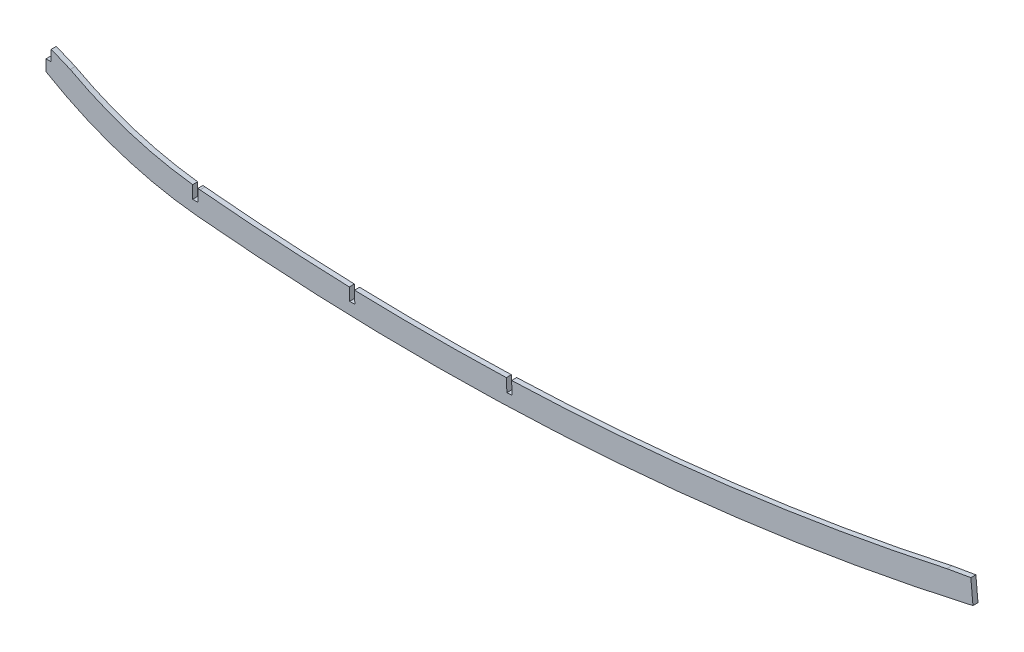
ISO-10303-21;
HEADER;
FILE_DESCRIPTION(('STEP AP214'),'2;1');
FILE_NAME('part.step','',(''),(''),'','','');
FILE_SCHEMA(('AUTOMOTIVE_DESIGN { 1 0 10303 214 1 1 1 1 }'));
ENDSEC;
DATA;
#1=APPLICATION_CONTEXT('core data for automotive mechanical design processes');
#2=APPLICATION_PROTOCOL_DEFINITION('international standard','automotive_design',2000,#1);
#3=PRODUCT_CONTEXT('',#1,'mechanical');
#4=PRODUCT('Part','Part','',(#3));
#5=PRODUCT_RELATED_PRODUCT_CATEGORY('part','',(#4));
#6=PRODUCT_DEFINITION_FORMATION('','',#4);
#7=PRODUCT_DEFINITION_CONTEXT('part definition',#1,'design');
#8=PRODUCT_DEFINITION('design','',#6,#7);
#9=PRODUCT_DEFINITION_SHAPE('','',#8);
#10=(LENGTH_UNIT() NAMED_UNIT(*) SI_UNIT(.MILLI.,.METRE.));
#11=(NAMED_UNIT(*) PLANE_ANGLE_UNIT() SI_UNIT($,.RADIAN.));
#12=(NAMED_UNIT(*) SI_UNIT($,.STERADIAN.) SOLID_ANGLE_UNIT());
#13=UNCERTAINTY_MEASURE_WITH_UNIT(LENGTH_MEASURE(1.E-05),#10,'distance_accuracy_value','');
#14=(GEOMETRIC_REPRESENTATION_CONTEXT(3) GLOBAL_UNCERTAINTY_ASSIGNED_CONTEXT((#13)) GLOBAL_UNIT_ASSIGNED_CONTEXT((#10,
#11,#12)) REPRESENTATION_CONTEXT('',''));
#15=CARTESIAN_POINT('',(0.,0.,0.));
#16=DIRECTION('',(0.,0.,1.));
#17=DIRECTION('',(1.,0.,0.));
#18=AXIS2_PLACEMENT_3D('',#15,#16,#17);
#19=CARTESIAN_POINT('',(240.577079738142,1407.58831419098,1.5875));
#20=DIRECTION('',(0.,0.,-1.));
#21=DIRECTION('',(-1.,0.,0.));
#22=AXIS2_PLACEMENT_3D('',#19,#20,#21);
#23=CYLINDRICAL_SURFACE('',#22,1527.94116944839);
#24=CARTESIAN_POINT('',(240.577079738142,1407.58831419098,-1.5875));
#25=DIRECTION('',(0.,0.,1.));
#26=DIRECTION('',(1.,0.,0.));
#27=AXIS2_PLACEMENT_3D('',#24,#25,#26);
#28=CIRCLE('',#27,1527.94116944839);
#29=CARTESIAN_POINT('',(293.085752085941,-119.450341712521,-1.5875));
#30=VERTEX_POINT('',#29);
#31=CARTESIAN_POINT('',(567.129437002182,-85.0495438511498,-1.5875));
#32=VERTEX_POINT('',#31);
#33=EDGE_CURVE('E217',#30,#32,#28,.T.);
#34=ORIENTED_EDGE('',*,*,#33,.F.);
#35=DIRECTION('',(0.,0.,-1.));
#36=VECTOR('',#35,1.);
#37=CARTESIAN_POINT('',(293.085752085941,-119.450341712521,1.5875));
#38=LINE('',#37,#36);
#39=CARTESIAN_POINT('',(293.085752085941,-119.450341712521,1.5875));
#40=VERTEX_POINT('',#39);
#41=EDGE_CURVE('E11',#40,#30,#38,.T.);
#42=ORIENTED_EDGE('',*,*,#41,.F.);
#43=CARTESIAN_POINT('',(240.577079738142,1407.58831419098,1.5875));
#44=DIRECTION('',(0.,0.,1.));
#45=DIRECTION('',(1.,0.,0.));
#46=AXIS2_PLACEMENT_3D('',#43,#44,#45);
#47=CIRCLE('',#46,1527.94116944839);
#48=CARTESIAN_POINT('',(567.129437002182,-85.0495438511498,1.5875));
#49=VERTEX_POINT('',#48);
#50=EDGE_CURVE('E278',#40,#49,#47,.T.);
#51=ORIENTED_EDGE('',*,*,#50,.T.);
#52=DIRECTION('',(0.,0.,-1.));
#53=VECTOR('',#52,1.);
#54=CARTESIAN_POINT('',(567.129437002182,-85.0495438511498,1.5875));
#55=LINE('',#54,#53);
#56=EDGE_CURVE('E55',#49,#32,#55,.T.);
#57=ORIENTED_EDGE('',*,*,#56,.T.);
#58=EDGE_LOOP('',(#34,#42,#51,#57));
#59=FACE_BOUND('',#58,.T.);
#60=ADVANCED_FACE('F39',(#59),#23,.F.);
#61=CARTESIAN_POINT('',(287.4127535148,12.3691297078382,1.5875));
#62=DIRECTION('',(-0.999075230575242,-0.0429963213662236,0.));
#63=DIRECTION('',(0.0429963213662236,-0.999075230575242,0.));
#64=AXIS2_PLACEMENT_3D('',#61,#62,#63);
#65=PLANE('',#64);
#66=DIRECTION('',(-0.0429963213662236,0.999075230575242,0.));
#67=VECTOR('',#66,1.);
#68=CARTESIAN_POINT('',(287.4127535148,12.3691297078382,-1.5875));
#69=LINE('',#68,#67);
#70=CARTESIAN_POINT('',(293.430570154345,-127.462636258907,-1.5875));
#71=VERTEX_POINT('',#70);
#72=EDGE_CURVE('E219',#71,#30,#69,.T.);
#73=ORIENTED_EDGE('',*,*,#72,.F.);
#74=DIRECTION('',(0.,0.,-1.));
#75=VECTOR('',#74,1.);
#76=CARTESIAN_POINT('',(293.430570154345,-127.462636258907,1.5875));
#77=LINE('',#76,#75);
#78=CARTESIAN_POINT('',(293.430570154345,-127.462636258907,1.5875));
#79=VERTEX_POINT('',#78);
#80=EDGE_CURVE('E47',#79,#71,#77,.T.);
#81=ORIENTED_EDGE('',*,*,#80,.F.);
#82=DIRECTION('',(-0.0429963213662236,0.999075230575242,0.));
#83=VECTOR('',#82,1.);
#84=CARTESIAN_POINT('',(287.4127535148,12.3691297078382,1.5875));
#85=LINE('',#84,#83);
#86=EDGE_CURVE('E338',#79,#40,#85,.T.);
#87=ORIENTED_EDGE('',*,*,#86,.T.);
#88=ORIENTED_EDGE('',*,*,#41,.T.);
#89=EDGE_LOOP('',(#73,#81,#87,#88));
#90=FACE_BOUND('',#89,.T.);
#91=ADVANCED_FACE('F323',(#90),#65,.T.);
#92=CARTESIAN_POINT('',(6.01781663954573,-139.831765966747,1.5875));
#93=DIRECTION('',(-0.0429963213662297,0.999075230575242,0.));
#94=DIRECTION('',(-0.999075230575242,-0.0429963213662297,0.));
#95=AXIS2_PLACEMENT_3D('',#92,#93,#94);
#96=PLANE('',#95);
#97=DIRECTION('',(0.999075230575242,0.0429963213662298,0.));
#98=VECTOR('',#97,1.);
#99=CARTESIAN_POINT('',(6.01781663954573,-139.831765966747,-1.5875));
#100=LINE('',#99,#98);
#101=CARTESIAN_POINT('',(290.131623742986,-127.604610112058,-1.5875));
#102=VERTEX_POINT('',#101);
#103=EDGE_CURVE('E222',#102,#71,#100,.T.);
#104=ORIENTED_EDGE('',*,*,#103,.F.);
#105=DIRECTION('',(0.,0.,-1.));
#106=VECTOR('',#105,1.);
#107=CARTESIAN_POINT('',(290.131623742986,-127.604610112058,1.5875));
#108=LINE('',#107,#106);
#109=CARTESIAN_POINT('',(290.131623742986,-127.604610112058,1.5875));
#110=VERTEX_POINT('',#109);
#111=EDGE_CURVE('E312',#110,#102,#108,.T.);
#112=ORIENTED_EDGE('',*,*,#111,.F.);
#113=DIRECTION('',(0.999075230575242,0.0429963213662298,0.));
#114=VECTOR('',#113,1.);
#115=CARTESIAN_POINT('',(6.01781663954573,-139.831765966747,1.5875));
#116=LINE('',#115,#114);
#117=EDGE_CURVE('E319',#110,#79,#116,.T.);
#118=ORIENTED_EDGE('',*,*,#117,.T.);
#119=ORIENTED_EDGE('',*,*,#80,.T.);
#120=EDGE_LOOP('',(#104,#112,#118,#119));
#121=FACE_BOUND('',#120,.T.);
#122=ADVANCED_FACE('F317',(#121),#96,.T.);
#123=CARTESIAN_POINT('',(284.11380710344,12.2271558546878,1.5875));
#124=DIRECTION('',(-0.999075230575242,-0.0429963213662266,0.));
#125=DIRECTION('',(0.0429963213662266,-0.999075230575242,0.));
#126=AXIS2_PLACEMENT_3D('',#123,#124,#125);
#127=PLANE('',#126);
#128=DIRECTION('',(-0.0429963213662266,0.999075230575242,0.));
#129=VECTOR('',#128,1.);
#130=CARTESIAN_POINT('',(284.11380710344,12.2271558546878,-1.5875));
#131=LINE('',#130,#129);
#132=CARTESIAN_POINT('',(289.785425962609,-119.560256170512,-1.5875));
#133=VERTEX_POINT('',#132);
#134=EDGE_CURVE('E225',#102,#133,#131,.T.);
#135=ORIENTED_EDGE('',*,*,#134,.T.);
#136=DIRECTION('',(0.,0.,-1.));
#137=VECTOR('',#136,1.);
#138=CARTESIAN_POINT('',(289.785425962609,-119.560256170512,1.5875));
#139=LINE('',#138,#137);
#140=CARTESIAN_POINT('',(289.785425962609,-119.560256170512,1.5875));
#141=VERTEX_POINT('',#140);
#142=EDGE_CURVE('E310',#141,#133,#139,.T.);
#143=ORIENTED_EDGE('',*,*,#142,.F.);
#144=DIRECTION('',(-0.0429963213662266,0.999075230575242,0.));
#145=VECTOR('',#144,1.);
#146=CARTESIAN_POINT('',(284.11380710344,12.2271558546878,1.5875));
#147=LINE('',#146,#145);
#148=EDGE_CURVE('E334',#110,#141,#147,.T.);
#149=ORIENTED_EDGE('',*,*,#148,.F.);
#150=ORIENTED_EDGE('',*,*,#111,.T.);
#151=EDGE_LOOP('',(#135,#143,#149,#150));
#152=FACE_BOUND('',#151,.T.);
#153=ADVANCED_FACE('F331',(#152),#127,.F.);
#154=CARTESIAN_POINT('',(240.577079738142,1407.58831419098,1.5875));
#155=DIRECTION('',(0.,0.,-1.));
#156=DIRECTION('',(-1.,0.,0.));
#157=AXIS2_PLACEMENT_3D('',#154,#155,#156);
#158=CYLINDRICAL_SURFACE('',#157,1527.94116944839);
#159=CARTESIAN_POINT('',(240.577079738142,1407.58831419098,-1.5875));
#160=DIRECTION('',(0.,0.,1.));
#161=DIRECTION('',(1.,0.,0.));
#162=AXIS2_PLACEMENT_3D('',#159,#160,#161);
#163=CIRCLE('',#162,1527.94116944839);
#164=CARTESIAN_POINT('',(194.229812032864,-119.649764194821,-1.5875));
#165=VERTEX_POINT('',#164);
#166=EDGE_CURVE('E228',#165,#133,#163,.T.);
#167=ORIENTED_EDGE('',*,*,#166,.F.);
#168=DIRECTION('',(0.,0.,-1.));
#169=VECTOR('',#168,1.);
#170=CARTESIAN_POINT('',(194.229812032864,-119.649764194821,1.5875));
#171=LINE('',#170,#169);
#172=CARTESIAN_POINT('',(194.229812032864,-119.649764194821,1.5875));
#173=VERTEX_POINT('',#172);
#174=EDGE_CURVE('E308',#173,#165,#171,.T.);
#175=ORIENTED_EDGE('',*,*,#174,.F.);
#176=CARTESIAN_POINT('',(240.577079738142,1407.58831419098,1.5875));
#177=DIRECTION('',(0.,0.,1.));
#178=DIRECTION('',(1.,0.,0.));
#179=AXIS2_PLACEMENT_3D('',#176,#177,#178);
#180=CIRCLE('',#179,1527.94116944839);
#181=EDGE_CURVE('E336',#173,#141,#180,.T.);
#182=ORIENTED_EDGE('',*,*,#181,.T.);
#183=ORIENTED_EDGE('',*,*,#142,.T.);
#184=EDGE_LOOP('',(#167,#175,#182,#183));
#185=FACE_BOUND('',#184,.T.);
#186=ADVANCED_FACE('F583',(#185),#158,.F.);
#187=CARTESIAN_POINT('',(191.641201645556,4.01163506310581,1.5875));
#188=DIRECTION('',(0.999780975664747,0.0209284662325422,0.));
#189=DIRECTION('',(-0.0209284662325422,0.999780975664747,0.));
#190=AXIS2_PLACEMENT_3D('',#187,#188,#189);
#191=PLANE('',#190);
#192=DIRECTION('',(0.0209284662325422,-0.999780975664747,0.));
#193=VECTOR('',#192,1.);
#194=CARTESIAN_POINT('',(191.641201645556,4.01163506310581,-1.5875));
#195=LINE('',#194,#193);
#196=CARTESIAN_POINT('',(194.389286945556,-127.268095229386,-1.5875));
#197=VERTEX_POINT('',#196);
#198=EDGE_CURVE('E231',#165,#197,#195,.T.);
#199=ORIENTED_EDGE('',*,*,#198,.T.);
#200=DIRECTION('',(0.,0.,-1.));
#201=VECTOR('',#200,1.);
#202=CARTESIAN_POINT('',(194.389286945556,-127.268095229386,1.5875));
#203=LINE('',#202,#201);
#204=CARTESIAN_POINT('',(194.389286945556,-127.268095229386,1.5875));
#205=VERTEX_POINT('',#204);
#206=EDGE_CURVE('E306',#205,#197,#203,.T.);
#207=ORIENTED_EDGE('',*,*,#206,.F.);
#208=DIRECTION('',(0.0209284662325422,-0.999780975664747,0.));
#209=VECTOR('',#208,1.);
#210=CARTESIAN_POINT('',(191.641201645556,4.01163506310581,1.5875));
#211=LINE('',#210,#209);
#212=EDGE_CURVE('E344',#173,#205,#211,.T.);
#213=ORIENTED_EDGE('',*,*,#212,.F.);
#214=ORIENTED_EDGE('',*,*,#174,.T.);
#215=EDGE_LOOP('',(#199,#207,#213,#214));
#216=FACE_BOUND('',#215,.T.);
#217=ADVANCED_FACE('F572',(#216),#191,.F.);
#218=CARTESIAN_POINT('',(2.74808529999937,-131.279730292491,1.5875));
#219=DIRECTION('',(-0.0209284662325396,0.999780975664747,0.));
#220=DIRECTION('',(-0.999780975664747,-0.0209284662325396,0.));
#221=AXIS2_PLACEMENT_3D('',#218,#219,#220);
#222=PLANE('',#221);
#223=DIRECTION('',(0.999780975664747,0.0209284662325396,0.));
#224=VECTOR('',#223,1.);
#225=CARTESIAN_POINT('',(2.74808529999937,-131.279730292491,-1.5875));
#226=LINE('',#225,#224);
#227=CARTESIAN_POINT('',(191.088010163911,-127.337201024886,-1.5875));
#228=VERTEX_POINT('',#227);
#229=EDGE_CURVE('E234',#228,#197,#226,.T.);
#230=ORIENTED_EDGE('',*,*,#229,.F.);
#231=DIRECTION('',(0.,0.,-1.));
#232=VECTOR('',#231,1.);
#233=CARTESIAN_POINT('',(191.088010163911,-127.337201024886,1.5875));
#234=LINE('',#233,#232);
#235=CARTESIAN_POINT('',(191.088010163911,-127.337201024886,1.5875));
#236=VERTEX_POINT('',#235);
#237=EDGE_CURVE('E304',#236,#228,#234,.T.);
#238=ORIENTED_EDGE('',*,*,#237,.F.);
#239=DIRECTION('',(0.999780975664747,0.0209284662325396,0.));
#240=VECTOR('',#239,1.);
#241=CARTESIAN_POINT('',(2.74808529999937,-131.279730292491,1.5875));
#242=LINE('',#241,#240);
#243=EDGE_CURVE('E346',#236,#205,#242,.T.);
#244=ORIENTED_EDGE('',*,*,#243,.T.);
#245=ORIENTED_EDGE('',*,*,#206,.T.);
#246=EDGE_LOOP('',(#230,#238,#244,#245));
#247=FACE_BOUND('',#246,.T.);
#248=ADVANCED_FACE('F561',(#247),#222,.T.);
#249=CARTESIAN_POINT('',(188.339924863911,3.94252926760601,1.5875));
#250=DIRECTION('',(0.999780975664747,0.0209284662325425,0.));
#251=DIRECTION('',(-0.0209284662325425,0.999780975664747,0.));
#252=AXIS2_PLACEMENT_3D('',#249,#250,#251);
#253=PLANE('',#252);
#254=DIRECTION('',(0.0209284662325425,-0.999780975664747,0.));
#255=VECTOR('',#254,1.);
#256=CARTESIAN_POINT('',(188.339924863911,3.94252926760601,-1.5875));
#257=LINE('',#256,#255);
#258=CARTESIAN_POINT('',(190.924914266976,-119.545890703705,-1.5875));
#259=VERTEX_POINT('',#258);
#260=EDGE_CURVE('E237',#259,#228,#257,.T.);
#261=ORIENTED_EDGE('',*,*,#260,.F.);
#262=DIRECTION('',(0.,0.,-1.));
#263=VECTOR('',#262,1.);
#264=CARTESIAN_POINT('',(190.924914266976,-119.545890703705,1.5875));
#265=LINE('',#264,#263);
#266=CARTESIAN_POINT('',(190.924914266976,-119.545890703705,1.5875));
#267=VERTEX_POINT('',#266);
#268=EDGE_CURVE('E302',#267,#259,#265,.T.);
#269=ORIENTED_EDGE('',*,*,#268,.F.);
#270=DIRECTION('',(0.0209284662325425,-0.999780975664747,0.));
#271=VECTOR('',#270,1.);
#272=CARTESIAN_POINT('',(188.339924863911,3.94252926760601,1.5875));
#273=LINE('',#272,#271);
#274=EDGE_CURVE('E349',#267,#236,#273,.T.);
#275=ORIENTED_EDGE('',*,*,#274,.T.);
#276=ORIENTED_EDGE('',*,*,#237,.T.);
#277=EDGE_LOOP('',(#261,#269,#275,#276));
#278=FACE_BOUND('',#277,.T.);
#279=ADVANCED_FACE('F550',(#278),#253,.T.);
#280=CARTESIAN_POINT('',(240.577079738142,1407.58831419098,1.5875));
#281=DIRECTION('',(0.,0.,-1.));
#282=DIRECTION('',(-1.,0.,0.));
#283=AXIS2_PLACEMENT_3D('',#280,#281,#282);
#284=CYLINDRICAL_SURFACE('',#283,1527.94116944839);
#285=CARTESIAN_POINT('',(240.577079738142,1407.58831419098,-1.5875));
#286=DIRECTION('',(0.,0.,1.));
#287=DIRECTION('',(1.,0.,0.));
#288=AXIS2_PLACEMENT_3D('',#285,#286,#287);
#289=CIRCLE('',#288,1527.94116944839);
#290=CARTESIAN_POINT('',(96.9995716445748,-113.592055280352,-1.5875));
#291=VERTEX_POINT('',#290);
#292=EDGE_CURVE('E240',#291,#259,#289,.T.);
#293=ORIENTED_EDGE('',*,*,#292,.F.);
#294=DIRECTION('',(0.,0.,-1.));
#295=VECTOR('',#294,1.);
#296=CARTESIAN_POINT('',(96.9995716445748,-113.592055280352,1.5875));
#297=LINE('',#296,#295);
#298=CARTESIAN_POINT('',(96.9995716445748,-113.592055280352,1.5875));
#299=VERTEX_POINT('',#298);
#300=EDGE_CURVE('E300',#299,#291,#297,.T.);
#301=ORIENTED_EDGE('',*,*,#300,.F.);
#302=CARTESIAN_POINT('',(240.577079738142,1407.58831419098,1.5875));
#303=DIRECTION('',(0.,0.,1.));
#304=DIRECTION('',(1.,0.,0.));
#305=AXIS2_PLACEMENT_3D('',#302,#303,#304);
#306=CIRCLE('',#305,1527.94116944839);
#307=EDGE_CURVE('E352',#299,#267,#306,.T.);
#308=ORIENTED_EDGE('',*,*,#307,.T.);
#309=ORIENTED_EDGE('',*,*,#268,.T.);
#310=EDGE_LOOP('',(#293,#301,#308,#309));
#311=FACE_BOUND('',#310,.T.);
#312=ADVANCED_FACE('F539',(#311),#284,.F.);
#313=CARTESIAN_POINT('',(117.159584001554,100.,1.5875));
#314=DIRECTION('',(0.,0.,-1.));
#315=DIRECTION('',(-1.,0.,0.));
#316=AXIS2_PLACEMENT_3D('',#313,#314,#315);
#317=CYLINDRICAL_SURFACE('',#316,214.541353070029);
#318=CARTESIAN_POINT('',(117.159584001554,100.,-1.5875));
#319=DIRECTION('',(0.,0.,1.));
#320=DIRECTION('',(1.,0.,0.));
#321=AXIS2_PLACEMENT_3D('',#318,#319,#320);
#322=CIRCLE('',#321,214.541353070029);
#323=CARTESIAN_POINT('',(95.6310000000008,-113.45845555519,-1.5875));
#324=VERTEX_POINT('',#323);
#325=EDGE_CURVE('E243',#324,#291,#322,.T.);
#326=ORIENTED_EDGE('',*,*,#325,.F.);
#327=DIRECTION('',(0.,0.,-1.));
#328=VECTOR('',#327,1.);
#329=CARTESIAN_POINT('',(95.6310000000008,-113.45845555519,1.5875));
#330=LINE('',#329,#328);
#331=CARTESIAN_POINT('',(95.6310000000008,-113.45845555519,1.5875));
#332=VERTEX_POINT('',#331);
#333=EDGE_CURVE('E298',#332,#324,#330,.T.);
#334=ORIENTED_EDGE('',*,*,#333,.F.);
#335=CARTESIAN_POINT('',(117.159584001554,100.,1.5875));
#336=DIRECTION('',(0.,0.,1.));
#337=DIRECTION('',(1.,0.,0.));
#338=AXIS2_PLACEMENT_3D('',#335,#336,#337);
#339=CIRCLE('',#338,214.541353070029);
#340=EDGE_CURVE('E355',#332,#299,#339,.T.);
#341=ORIENTED_EDGE('',*,*,#340,.T.);
#342=ORIENTED_EDGE('',*,*,#300,.T.);
#343=EDGE_LOOP('',(#326,#334,#341,#342));
#344=FACE_BOUND('',#343,.T.);
#345=ADVANCED_FACE('F528',(#344),#317,.F.);
#346=CARTESIAN_POINT('',(95.6310000000008,0.,1.5875));
#347=DIRECTION('',(-1.,0.,0.));
#348=DIRECTION('',(0.,0.,1.));
#349=AXIS2_PLACEMENT_3D('',#346,#347,#348);
#350=PLANE('',#349);
#351=DIRECTION('',(0.,1.,0.));
#352=VECTOR('',#351,1.);
#353=CARTESIAN_POINT('',(95.6310000000008,0.,-1.5875));
#354=LINE('',#353,#352);
#355=CARTESIAN_POINT('',(95.6310000000008,-121.07845555519,-1.5875));
#356=VERTEX_POINT('',#355);
#357=EDGE_CURVE('E246',#356,#324,#354,.T.);
#358=ORIENTED_EDGE('',*,*,#357,.F.);
#359=DIRECTION('',(0.,0.,-1.));
#360=VECTOR('',#359,1.);
#361=CARTESIAN_POINT('',(95.6310000000008,-121.07845555519,1.5875));
#362=LINE('',#361,#360);
#363=CARTESIAN_POINT('',(95.6310000000008,-121.07845555519,1.5875));
#364=VERTEX_POINT('',#363);
#365=EDGE_CURVE('E296',#364,#356,#362,.T.);
#366=ORIENTED_EDGE('',*,*,#365,.F.);
#367=DIRECTION('',(0.,1.,0.));
#368=VECTOR('',#367,1.);
#369=CARTESIAN_POINT('',(95.6310000000008,0.,1.5875));
#370=LINE('',#369,#368);
#371=EDGE_CURVE('E358',#364,#332,#370,.T.);
#372=ORIENTED_EDGE('',*,*,#371,.T.);
#373=ORIENTED_EDGE('',*,*,#333,.T.);
#374=EDGE_LOOP('',(#358,#366,#372,#373));
#375=FACE_BOUND('',#374,.T.);
#376=ADVANCED_FACE('F517',(#375),#350,.T.);
#377=CARTESIAN_POINT('',(0.,-121.07845555519,1.5875));
#378=DIRECTION('',(0.,1.,0.));
#379=DIRECTION('',(0.,0.,1.));
#380=AXIS2_PLACEMENT_3D('',#377,#378,#379);
#381=PLANE('',#380);
#382=DIRECTION('',(1.,0.,0.));
#383=VECTOR('',#382,1.);
#384=CARTESIAN_POINT('',(0.,-121.07845555519,-1.5875));
#385=LINE('',#384,#383);
#386=CARTESIAN_POINT('',(92.3290000000008,-121.07845555519,-1.5875));
#387=VERTEX_POINT('',#386);
#388=EDGE_CURVE('E249',#387,#356,#385,.T.);
#389=ORIENTED_EDGE('',*,*,#388,.F.);
#390=DIRECTION('',(0.,0.,-1.));
#391=VECTOR('',#390,1.);
#392=CARTESIAN_POINT('',(92.3290000000008,-121.07845555519,1.5875));
#393=LINE('',#392,#391);
#394=CARTESIAN_POINT('',(92.3290000000008,-121.07845555519,1.5875));
#395=VERTEX_POINT('',#394);
#396=EDGE_CURVE('E294',#395,#387,#393,.T.);
#397=ORIENTED_EDGE('',*,*,#396,.F.);
#398=DIRECTION('',(1.,0.,0.));
#399=VECTOR('',#398,1.);
#400=CARTESIAN_POINT('',(0.,-121.07845555519,1.5875));
#401=LINE('',#400,#399);
#402=EDGE_CURVE('E361',#395,#364,#401,.T.);
#403=ORIENTED_EDGE('',*,*,#402,.T.);
#404=ORIENTED_EDGE('',*,*,#365,.T.);
#405=EDGE_LOOP('',(#389,#397,#403,#404));
#406=FACE_BOUND('',#405,.T.);
#407=ADVANCED_FACE('F506',(#406),#381,.T.);
#408=CARTESIAN_POINT('',(92.329000000001,-1.60589483716795E-13,1.5875));
#409=DIRECTION('',(-1.,0.,0.));
#410=DIRECTION('',(0.,-1.,0.));
#411=AXIS2_PLACEMENT_3D('',#408,#409,#410);
#412=PLANE('',#411);
#413=DIRECTION('',(0.,1.,0.));
#414=VECTOR('',#413,1.);
#415=CARTESIAN_POINT('',(92.329000000001,-1.60589483716795E-13,-1.5875));
#416=LINE('',#415,#414);
#417=CARTESIAN_POINT('',(92.3290000000008,-113.099587693784,-1.5875));
#418=VERTEX_POINT('',#417);
#419=EDGE_CURVE('E252',#387,#418,#416,.T.);
#420=ORIENTED_EDGE('',*,*,#419,.T.);
#421=DIRECTION('',(0.,0.,-1.));
#422=VECTOR('',#421,1.);
#423=CARTESIAN_POINT('',(92.3290000000008,-113.099587693784,1.5875));
#424=LINE('',#423,#422);
#425=CARTESIAN_POINT('',(92.3290000000008,-113.099587693784,1.5875));
#426=VERTEX_POINT('',#425);
#427=EDGE_CURVE('E292',#426,#418,#424,.T.);
#428=ORIENTED_EDGE('',*,*,#427,.F.);
#429=DIRECTION('',(0.,1.,0.));
#430=VECTOR('',#429,1.);
#431=CARTESIAN_POINT('',(92.329000000001,-1.60589483716795E-13,1.5875));
#432=LINE('',#431,#430);
#433=EDGE_CURVE('E364',#395,#426,#432,.T.);
#434=ORIENTED_EDGE('',*,*,#433,.F.);
#435=ORIENTED_EDGE('',*,*,#396,.T.);
#436=EDGE_LOOP('',(#420,#428,#434,#435));
#437=FACE_BOUND('',#436,.T.);
#438=ADVANCED_FACE('F495',(#437),#412,.F.);
#439=CARTESIAN_POINT('',(117.159584001554,100.,1.5875));
#440=DIRECTION('',(0.,0.,-1.));
#441=DIRECTION('',(-1.,0.,0.));
#442=AXIS2_PLACEMENT_3D('',#439,#440,#441);
#443=CYLINDRICAL_SURFACE('',#442,214.541353070029);
#444=CARTESIAN_POINT('',(117.159584001554,100.,-1.5875));
#445=DIRECTION('',(0.,0.,1.));
#446=DIRECTION('',(1.,0.,0.));
#447=AXIS2_PLACEMENT_3D('',#444,#445,#446);
#448=CIRCLE('',#447,214.541353070029);
#449=CARTESIAN_POINT('',(15.24,-88.7866271060241,-1.5875));
#450=VERTEX_POINT('',#449);
#451=EDGE_CURVE('E255',#450,#418,#448,.T.);
#452=ORIENTED_EDGE('',*,*,#451,.F.);
#453=DIRECTION('',(0.,0.,-1.));
#454=VECTOR('',#453,1.);
#455=CARTESIAN_POINT('',(15.24,-88.7866271060241,1.5875));
#456=LINE('',#455,#454);
#457=CARTESIAN_POINT('',(15.24,-88.7866271060241,1.5875));
#458=VERTEX_POINT('',#457);
#459=EDGE_CURVE('E290',#458,#450,#456,.T.);
#460=ORIENTED_EDGE('',*,*,#459,.F.);
#461=CARTESIAN_POINT('',(117.159584001554,100.,1.5875));
#462=DIRECTION('',(0.,0.,1.));
#463=DIRECTION('',(1.,0.,0.));
#464=AXIS2_PLACEMENT_3D('',#461,#462,#463);
#465=CIRCLE('',#464,214.541353070029);
#466=EDGE_CURVE('E366',#458,#426,#465,.T.);
#467=ORIENTED_EDGE('',*,*,#466,.T.);
#468=ORIENTED_EDGE('',*,*,#427,.T.);
#469=EDGE_LOOP('',(#452,#460,#467,#468));
#470=FACE_BOUND('',#469,.T.);
#471=ADVANCED_FACE('F484',(#470),#443,.F.);
#472=CARTESIAN_POINT('',(-29.2889692925444,-70.2111111736083,1.5875));
#473=DIRECTION('',(0.384999967886905,0.922916586007144,0.));
#474=DIRECTION('',(-0.922916586007144,0.384999967886905,0.));
#475=AXIS2_PLACEMENT_3D('',#472,#473,#474);
#476=PLANE('',#475);
#477=DIRECTION('',(0.922916586007144,-0.384999967886905,0.));
#478=VECTOR('',#477,1.);
#479=CARTESIAN_POINT('',(-29.2889692925444,-70.2111111736083,-1.5875));
#480=LINE('',#479,#478);
#481=CARTESIAN_POINT('',(3.302,-83.8066216685682,-1.5875));
#482=VERTEX_POINT('',#481);
#483=EDGE_CURVE('E258',#482,#450,#480,.T.);
#484=ORIENTED_EDGE('',*,*,#483,.F.);
#485=DIRECTION('',(0.,0.,-1.));
#486=VECTOR('',#485,1.);
#487=CARTESIAN_POINT('',(3.302,-83.8066216685682,1.5875));
#488=LINE('',#487,#486);
#489=CARTESIAN_POINT('',(3.302,-83.8066216685682,1.5875));
#490=VERTEX_POINT('',#489);
#491=EDGE_CURVE('E288',#490,#482,#488,.T.);
#492=ORIENTED_EDGE('',*,*,#491,.F.);
#493=DIRECTION('',(0.922916586007144,-0.384999967886905,0.));
#494=VECTOR('',#493,1.);
#495=CARTESIAN_POINT('',(-29.2889692925444,-70.2111111736083,1.5875));
#496=LINE('',#495,#494);
#497=EDGE_CURVE('E369',#490,#458,#496,.T.);
#498=ORIENTED_EDGE('',*,*,#497,.T.);
#499=ORIENTED_EDGE('',*,*,#459,.T.);
#500=EDGE_LOOP('',(#484,#492,#498,#499));
#501=FACE_BOUND('',#500,.T.);
#502=ADVANCED_FACE('F473',(#501),#476,.T.);
#503=CARTESIAN_POINT('',(3.302,0.,1.5875));
#504=DIRECTION('',(-1.,0.,0.));
#505=DIRECTION('',(0.,0.,1.));
#506=AXIS2_PLACEMENT_3D('',#503,#504,#505);
#507=PLANE('',#506);
#508=DIRECTION('',(0.,1.,0.));
#509=VECTOR('',#508,1.);
#510=CARTESIAN_POINT('',(3.302,0.,-1.5875));
#511=LINE('',#510,#509);
#512=CARTESIAN_POINT('',(3.302,-90.6646216685682,-1.5875));
#513=VERTEX_POINT('',#512);
#514=EDGE_CURVE('E261',#513,#482,#511,.T.);
#515=ORIENTED_EDGE('',*,*,#514,.F.);
#516=DIRECTION('',(0.,0.,-1.));
#517=VECTOR('',#516,1.);
#518=CARTESIAN_POINT('',(3.302,-90.6646216685682,1.5875));
#519=LINE('',#518,#517);
#520=CARTESIAN_POINT('',(3.302,-90.6646216685682,1.5875));
#521=VERTEX_POINT('',#520);
#522=EDGE_CURVE('E286',#521,#513,#519,.T.);
#523=ORIENTED_EDGE('',*,*,#522,.F.);
#524=DIRECTION('',(0.,1.,0.));
#525=VECTOR('',#524,1.);
#526=CARTESIAN_POINT('',(3.302,0.,1.5875));
#527=LINE('',#526,#525);
#528=EDGE_CURVE('E372',#521,#490,#527,.T.);
#529=ORIENTED_EDGE('',*,*,#528,.T.);
#530=ORIENTED_EDGE('',*,*,#491,.T.);
#531=EDGE_LOOP('',(#515,#523,#529,#530));
#532=FACE_BOUND('',#531,.T.);
#533=ADVANCED_FACE('F463',(#532),#507,.T.);
#534=CARTESIAN_POINT('',(0.,-90.6646216685682,1.5875));
#535=DIRECTION('',(0.,1.,0.));
#536=DIRECTION('',(0.,0.,1.));
#537=AXIS2_PLACEMENT_3D('',#534,#535,#536);
#538=PLANE('',#537);
#539=DIRECTION('',(1.,0.,0.));
#540=VECTOR('',#539,1.);
#541=CARTESIAN_POINT('',(0.,-90.6646216685682,-1.5875));
#542=LINE('',#541,#540);
#543=CARTESIAN_POINT('',(0.,-90.6646216685682,-1.5875));
#544=VERTEX_POINT('',#543);
#545=EDGE_CURVE('E264',#544,#513,#542,.T.);
#546=ORIENTED_EDGE('',*,*,#545,.F.);
#547=DIRECTION('',(0.,0.,-1.));
#548=VECTOR('',#547,1.);
#549=CARTESIAN_POINT('',(0.,-90.6646216685682,1.5875));
#550=LINE('',#549,#548);
#551=CARTESIAN_POINT('',(0.,-90.6646216685682,1.5875));
#552=VERTEX_POINT('',#551);
#553=EDGE_CURVE('E284',#552,#544,#550,.T.);
#554=ORIENTED_EDGE('',*,*,#553,.F.);
#555=DIRECTION('',(1.,0.,0.));
#556=VECTOR('',#555,1.);
#557=CARTESIAN_POINT('',(0.,-90.6646216685682,1.5875));
#558=LINE('',#557,#556);
#559=EDGE_CURVE('E375',#552,#521,#558,.T.);
#560=ORIENTED_EDGE('',*,*,#559,.T.);
#561=ORIENTED_EDGE('',*,*,#522,.T.);
#562=EDGE_LOOP('',(#546,#554,#560,#561));
#563=FACE_BOUND('',#562,.T.);
#564=ADVANCED_FACE('F388',(#563),#538,.T.);
#565=CARTESIAN_POINT('',(3.56925398494294E-12,0.,1.5875));
#566=DIRECTION('',(-1.,0.,0.));
#567=DIRECTION('',(0.,-1.,0.));
#568=AXIS2_PLACEMENT_3D('',#565,#566,#567);
#569=PLANE('',#568);
#570=DIRECTION('',(0.,1.,0.));
#571=VECTOR('',#570,1.);
#572=CARTESIAN_POINT('',(3.56925398494294E-12,0.,-1.5875));
#573=LINE('',#572,#571);
#574=CARTESIAN_POINT('',(-2.75752808132646E-13,-97.6691733560803,-1.5875));
#575=VERTEX_POINT('',#574);
#576=EDGE_CURVE('E267',#575,#544,#573,.T.);
#577=ORIENTED_EDGE('',*,*,#576,.F.);
#578=DIRECTION('',(0.,0.,-1.));
#579=VECTOR('',#578,1.);
#580=CARTESIAN_POINT('',(-2.75752808132646E-13,-97.6691733560803,1.5875));
#581=LINE('',#580,#579);
#582=CARTESIAN_POINT('',(-2.75752808132646E-13,-97.6691733560803,1.5875));
#583=VERTEX_POINT('',#582);
#584=EDGE_CURVE('E282',#583,#575,#581,.T.);
#585=ORIENTED_EDGE('',*,*,#584,.F.);
#586=DIRECTION('',(0.,1.,0.));
#587=VECTOR('',#586,1.);
#588=CARTESIAN_POINT('',(3.56925398494294E-12,0.,1.5875));
#589=LINE('',#588,#587);
#590=EDGE_CURVE('E378',#583,#552,#589,.T.);
#591=ORIENTED_EDGE('',*,*,#590,.T.);
#592=ORIENTED_EDGE('',*,*,#553,.T.);
#593=EDGE_LOOP('',(#577,#585,#591,#592));
#594=FACE_BOUND('',#593,.T.);
#595=ADVANCED_FACE('F382',(#594),#569,.T.);
#596=CARTESIAN_POINT('',(117.159584001554,100.,1.5875));
#597=DIRECTION('',(0.,0.,-1.));
#598=DIRECTION('',(-1.,0.,0.));
#599=AXIS2_PLACEMENT_3D('',#596,#597,#598);
#600=CYLINDRICAL_SURFACE('',#599,229.781353070029);
#601=CARTESIAN_POINT('',(117.159584001554,100.,-1.5875));
#602=DIRECTION('',(0.,0.,1.));
#603=DIRECTION('',(1.,0.,0.));
#604=AXIS2_PLACEMENT_3D('',#601,#602,#603);
#605=CIRCLE('',#604,229.781353070029);
#606=CARTESIAN_POINT('',(95.5674999999997,-128.764621668568,-1.5875));
#607=VERTEX_POINT('',#606);
#608=EDGE_CURVE('E270',#575,#607,#605,.T.);
#609=ORIENTED_EDGE('',*,*,#608,.T.);
#610=DIRECTION('',(0.,0.,-1.));
#611=VECTOR('',#610,1.);
#612=CARTESIAN_POINT('',(95.5674999999997,-128.764621668568,1.5875));
#613=LINE('',#612,#611);
#614=CARTESIAN_POINT('',(95.5674999999997,-128.764621668568,1.5875));
#615=VERTEX_POINT('',#614);
#616=EDGE_CURVE('E209',#615,#607,#613,.T.);
#617=ORIENTED_EDGE('',*,*,#616,.F.);
#618=CARTESIAN_POINT('',(117.159584001554,100.,1.5875));
#619=DIRECTION('',(0.,0.,1.));
#620=DIRECTION('',(1.,0.,0.));
#621=AXIS2_PLACEMENT_3D('',#618,#619,#620);
#622=CIRCLE('',#621,229.781353070029);
#623=EDGE_CURVE('E197',#583,#615,#622,.T.);
#624=ORIENTED_EDGE('',*,*,#623,.F.);
#625=ORIENTED_EDGE('',*,*,#584,.T.);
#626=EDGE_LOOP('',(#609,#617,#624,#625));
#627=FACE_BOUND('',#626,.T.);
#628=ADVANCED_FACE('F392',(#627),#600,.T.);
#629=CARTESIAN_POINT('',(240.577079738142,1407.58831419098,1.5875));
#630=DIRECTION('',(0.,0.,-1.));
#631=DIRECTION('',(-1.,0.,0.));
#632=AXIS2_PLACEMENT_3D('',#629,#630,#631);
#633=CYLINDRICAL_SURFACE('',#632,1543.18116944839);
#634=CARTESIAN_POINT('',(240.577079738142,1407.58831419098,-1.5875));
#635=DIRECTION('',(0.,0.,1.));
#636=DIRECTION('',(1.,0.,0.));
#637=AXIS2_PLACEMENT_3D('',#634,#635,#636);
#638=CIRCLE('',#637,1543.18116944839);
#639=CARTESIAN_POINT('',(583.522459193085,-97.0035203111852,-1.5875));
#640=VERTEX_POINT('',#639);
#641=EDGE_CURVE('E206',#607,#640,#638,.T.);
#642=ORIENTED_EDGE('',*,*,#641,.T.);
#643=DIRECTION('',(0.,0.,-1.));
#644=VECTOR('',#643,1.);
#645=CARTESIAN_POINT('',(583.522459193085,-97.0035203111852,1.5875));
#646=LINE('',#645,#644);
#647=CARTESIAN_POINT('',(583.522459193085,-97.0035203111852,1.5875));
#648=VERTEX_POINT('',#647);
#649=EDGE_CURVE('E203',#648,#640,#646,.T.);
#650=ORIENTED_EDGE('',*,*,#649,.F.);
#651=CARTESIAN_POINT('',(240.577079738142,1407.58831419098,1.5875));
#652=DIRECTION('',(0.,0.,1.));
#653=DIRECTION('',(1.,0.,0.));
#654=AXIS2_PLACEMENT_3D('',#651,#652,#653);
#655=CIRCLE('',#654,1543.18116944839);
#656=EDGE_CURVE('E189',#615,#648,#655,.T.);
#657=ORIENTED_EDGE('',*,*,#656,.F.);
#658=ORIENTED_EDGE('',*,*,#616,.T.);
#659=EDGE_LOOP('',(#642,#650,#657,#658));
#660=FACE_BOUND('',#659,.T.);
#661=ADVANCED_FACE('F204',(#660),#633,.T.);
#662=CARTESIAN_POINT('',(569.941731741452,51.9603922217231,1.5875));
#663=DIRECTION('',(-0.995869934566642,-0.0907913730826406,0.));
#664=DIRECTION('',(0.0907913730826406,-0.995869934566643,0.));
#665=AXIS2_PLACEMENT_3D('',#662,#663,#664);
#666=PLANE('',#665);
#667=DIRECTION('',(-0.0907913730826406,0.995869934566643,0.));
#668=VECTOR('',#667,1.);
#669=CARTESIAN_POINT('',(569.941731741452,51.9603922217231,-1.5875));
#670=LINE('',#669,#668);
#671=CARTESIAN_POINT('',(582.192517175843,-82.415688618385,-1.5875));
#672=VERTEX_POINT('',#671);
#673=EDGE_CURVE('E273',#640,#672,#670,.T.);
#674=ORIENTED_EDGE('',*,*,#673,.T.);
#675=DIRECTION('',(0.,0.,-1.));
#676=VECTOR('',#675,1.);
#677=CARTESIAN_POINT('',(582.192517175843,-82.415688618385,1.5875));
#678=LINE('',#677,#676);
#679=CARTESIAN_POINT('',(582.192517175843,-82.415688618385,1.5875));
#680=VERTEX_POINT('',#679);
#681=EDGE_CURVE('E123',#680,#672,#678,.T.);
#682=ORIENTED_EDGE('',*,*,#681,.F.);
#683=DIRECTION('',(-0.0907913730826406,0.995869934566643,0.));
#684=VECTOR('',#683,1.);
#685=CARTESIAN_POINT('',(569.941731741452,51.9603922217231,1.5875));
#686=LINE('',#685,#684);
#687=EDGE_CURVE('E194',#648,#680,#686,.T.);
#688=ORIENTED_EDGE('',*,*,#687,.F.);
#689=ORIENTED_EDGE('',*,*,#649,.T.);
#690=EDGE_LOOP('',(#674,#682,#688,#689));
#691=FACE_BOUND('',#690,.T.);
#692=ADVANCED_FACE('F211',(#691),#666,.F.);
#693=CARTESIAN_POINT('',(31.2553052422529,-178.749827575797,1.5875));
#694=DIRECTION('',(-0.172241763536491,0.985054706548748,0.));
#695=DIRECTION('',(-0.985054706548748,-0.172241763536491,0.));
#696=AXIS2_PLACEMENT_3D('',#693,#694,#695);
#697=PLANE('',#696);
#698=DIRECTION('',(0.985054706548748,0.172241763536491,0.));
#699=VECTOR('',#698,1.);
#700=CARTESIAN_POINT('',(31.2553052422529,-178.749827575797,-1.5875));
#701=LINE('',#700,#699);
#702=EDGE_CURVE('E275',#32,#672,#701,.T.);
#703=ORIENTED_EDGE('',*,*,#702,.F.);
#704=ORIENTED_EDGE('',*,*,#56,.F.);
#705=DIRECTION('',(0.985054706548748,0.172241763536491,0.));
#706=VECTOR('',#705,1.);
#707=CARTESIAN_POINT('',(31.2553052422529,-178.749827575797,1.5875));
#708=LINE('',#707,#706);
#709=EDGE_CURVE('E212',#49,#680,#708,.T.);
#710=ORIENTED_EDGE('',*,*,#709,.T.);
#711=ORIENTED_EDGE('',*,*,#681,.T.);
#712=EDGE_LOOP('',(#703,#704,#710,#711));
#713=FACE_BOUND('',#712,.T.);
#714=ADVANCED_FACE('F405',(#713),#697,.T.);
#715=CARTESIAN_POINT('',(0.,0.,1.5875));
#716=DIRECTION('',(0.,0.,1.));
#717=DIRECTION('',(1.,0.,0.));
#718=AXIS2_PLACEMENT_3D('',#715,#716,#717);
#719=PLANE('',#718);
#720=ORIENTED_EDGE('',*,*,#50,.F.);
#721=ORIENTED_EDGE('',*,*,#86,.F.);
#722=ORIENTED_EDGE('',*,*,#117,.F.);
#723=ORIENTED_EDGE('',*,*,#148,.T.);
#724=ORIENTED_EDGE('',*,*,#181,.F.);
#725=ORIENTED_EDGE('',*,*,#212,.T.);
#726=ORIENTED_EDGE('',*,*,#243,.F.);
#727=ORIENTED_EDGE('',*,*,#274,.F.);
#728=ORIENTED_EDGE('',*,*,#307,.F.);
#729=ORIENTED_EDGE('',*,*,#340,.F.);
#730=ORIENTED_EDGE('',*,*,#371,.F.);
#731=ORIENTED_EDGE('',*,*,#402,.F.);
#732=ORIENTED_EDGE('',*,*,#433,.T.);
#733=ORIENTED_EDGE('',*,*,#466,.F.);
#734=ORIENTED_EDGE('',*,*,#497,.F.);
#735=ORIENTED_EDGE('',*,*,#528,.F.);
#736=ORIENTED_EDGE('',*,*,#559,.F.);
#737=ORIENTED_EDGE('',*,*,#590,.F.);
#738=ORIENTED_EDGE('',*,*,#623,.T.);
#739=ORIENTED_EDGE('',*,*,#656,.T.);
#740=ORIENTED_EDGE('',*,*,#687,.T.);
#741=ORIENTED_EDGE('',*,*,#709,.F.);
#742=EDGE_LOOP('',(#720,#721,#722,#723,#724,#725,#726,#727,#728,#729,#730,#731,#732,#733,#734,
#735,#736,#737,#738,#739,#740,#741));
#743=FACE_BOUND('',#742,.T.);
#744=ADVANCED_FACE('F191',(#743),#719,.T.);
#745=CARTESIAN_POINT('',(0.,0.,-1.5875));
#746=DIRECTION('',(0.,0.,1.));
#747=DIRECTION('',(1.,0.,0.));
#748=AXIS2_PLACEMENT_3D('',#745,#746,#747);
#749=PLANE('',#748);
#750=ORIENTED_EDGE('',*,*,#33,.T.);
#751=ORIENTED_EDGE('',*,*,#702,.T.);
#752=ORIENTED_EDGE('',*,*,#673,.F.);
#753=ORIENTED_EDGE('',*,*,#641,.F.);
#754=ORIENTED_EDGE('',*,*,#608,.F.);
#755=ORIENTED_EDGE('',*,*,#576,.T.);
#756=ORIENTED_EDGE('',*,*,#545,.T.);
#757=ORIENTED_EDGE('',*,*,#514,.T.);
#758=ORIENTED_EDGE('',*,*,#483,.T.);
#759=ORIENTED_EDGE('',*,*,#451,.T.);
#760=ORIENTED_EDGE('',*,*,#419,.F.);
#761=ORIENTED_EDGE('',*,*,#388,.T.);
#762=ORIENTED_EDGE('',*,*,#357,.T.);
#763=ORIENTED_EDGE('',*,*,#325,.T.);
#764=ORIENTED_EDGE('',*,*,#292,.T.);
#765=ORIENTED_EDGE('',*,*,#260,.T.);
#766=ORIENTED_EDGE('',*,*,#229,.T.);
#767=ORIENTED_EDGE('',*,*,#198,.F.);
#768=ORIENTED_EDGE('',*,*,#166,.T.);
#769=ORIENTED_EDGE('',*,*,#134,.F.);
#770=ORIENTED_EDGE('',*,*,#103,.T.);
#771=ORIENTED_EDGE('',*,*,#72,.T.);
#772=EDGE_LOOP('',(#750,#751,#752,#753,#754,#755,#756,#757,#758,#759,#760,#761,#762,#763,#764,
#765,#766,#767,#768,#769,#770,#771));
#773=FACE_BOUND('',#772,.T.);
#774=ADVANCED_FACE('F326',(#773),#749,.F.);
#775=CLOSED_SHELL('',(#60,#91,#122,#153,#186,#217,#248,#279,#312,#345,#376,#407,#438,#471,#502,
#533,#564,#595,#628,#661,#692,#714,#744,#774));
#776=MANIFOLD_SOLID_BREP('B2',#775);
#777=ADVANCED_BREP_SHAPE_REPRESENTATION('',(#18,#776),#14);
#778=SHAPE_DEFINITION_REPRESENTATION(#9,#777);
ENDSEC;
END-ISO-10303-21;
